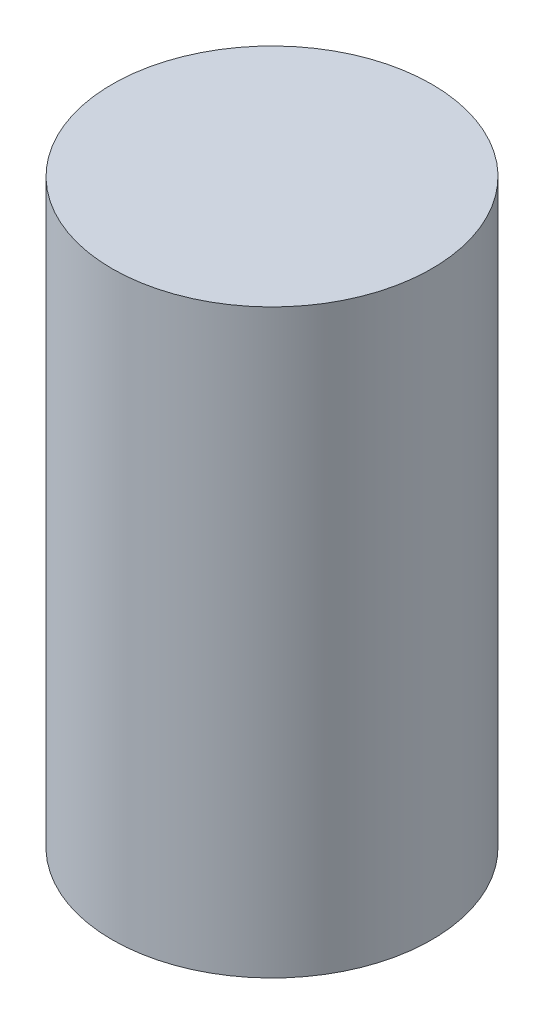
ISO-10303-21;
HEADER;
FILE_DESCRIPTION(('STEP AP214'),'2;1');
FILE_NAME('part.step','',(''),(''),'','','');
FILE_SCHEMA(('AUTOMOTIVE_DESIGN { 1 0 10303 214 1 1 1 1 }'));
ENDSEC;
DATA;
#1=APPLICATION_CONTEXT('core data for automotive mechanical design processes');
#2=APPLICATION_PROTOCOL_DEFINITION('international standard','automotive_design',2000,#1);
#3=PRODUCT_CONTEXT('',#1,'mechanical');
#4=PRODUCT('Part','Part','',(#3));
#5=PRODUCT_RELATED_PRODUCT_CATEGORY('part','',(#4));
#6=PRODUCT_DEFINITION_FORMATION('','',#4);
#7=PRODUCT_DEFINITION_CONTEXT('part definition',#1,'design');
#8=PRODUCT_DEFINITION('design','',#6,#7);
#9=PRODUCT_DEFINITION_SHAPE('','',#8);
#10=(LENGTH_UNIT() NAMED_UNIT(*) SI_UNIT(.MILLI.,.METRE.));
#11=(NAMED_UNIT(*) PLANE_ANGLE_UNIT() SI_UNIT($,.RADIAN.));
#12=(NAMED_UNIT(*) SI_UNIT($,.STERADIAN.) SOLID_ANGLE_UNIT());
#13=UNCERTAINTY_MEASURE_WITH_UNIT(LENGTH_MEASURE(1.E-05),#10,'distance_accuracy_value','');
#14=(GEOMETRIC_REPRESENTATION_CONTEXT(3) GLOBAL_UNCERTAINTY_ASSIGNED_CONTEXT((#13)) GLOBAL_UNIT_ASSIGNED_CONTEXT((#10,
#11,#12)) REPRESENTATION_CONTEXT('',''));
#15=CARTESIAN_POINT('',(0.,0.,0.));
#16=DIRECTION('',(0.,0.,1.));
#17=DIRECTION('',(1.,0.,0.));
#18=AXIS2_PLACEMENT_3D('',#15,#16,#17);
#19=CARTESIAN_POINT('',(0.,40.,0.));
#20=DIRECTION('',(0.,-1.,0.));
#21=DIRECTION('',(0.,0.,-1.));
#22=AXIS2_PLACEMENT_3D('',#19,#20,#21);
#23=CYLINDRICAL_SURFACE('',#22,11.);
#24=CARTESIAN_POINT('',(0.,40.,0.));
#25=DIRECTION('',(0.,1.,0.));
#26=DIRECTION('',(0.,0.,1.));
#27=AXIS2_PLACEMENT_3D('',#24,#25,#26);
#28=CIRCLE('',#27,11.);
#29=CARTESIAN_POINT('',(0.,40.,11.));
#30=VERTEX_POINT('',#29);
#31=EDGE_CURVE('E10',#30,#30,#28,.T.);
#32=ORIENTED_EDGE('',*,*,#31,.F.);
#33=EDGE_LOOP('',(#32));
#34=FACE_BOUND('',#33,.T.);
#35=CARTESIAN_POINT('',(0.,0.,0.));
#36=DIRECTION('',(0.,1.,0.));
#37=DIRECTION('',(0.,0.,1.));
#38=AXIS2_PLACEMENT_3D('',#35,#36,#37);
#39=CIRCLE('',#38,11.);
#40=CARTESIAN_POINT('',(0.,0.,11.));
#41=VERTEX_POINT('',#40);
#42=EDGE_CURVE('E38',#41,#41,#39,.T.);
#43=ORIENTED_EDGE('',*,*,#42,.T.);
#44=EDGE_LOOP('',(#43));
#45=FACE_BOUND('',#44,.T.);
#46=ADVANCED_FACE('F35',(#34,#45),#23,.T.);
#47=CARTESIAN_POINT('',(0.,40.,0.));
#48=DIRECTION('',(0.,1.,0.));
#49=DIRECTION('',(0.,0.,1.));
#50=AXIS2_PLACEMENT_3D('',#47,#48,#49);
#51=PLANE('',#50);
#52=ORIENTED_EDGE('',*,*,#31,.T.);
#53=EDGE_LOOP('',(#52));
#54=FACE_BOUND('',#53,.T.);
#55=ADVANCED_FACE('F50',(#54),#51,.T.);
#56=CARTESIAN_POINT('',(0.,0.,0.));
#57=DIRECTION('',(0.,1.,0.));
#58=DIRECTION('',(0.,0.,1.));
#59=AXIS2_PLACEMENT_3D('',#56,#57,#58);
#60=PLANE('',#59);
#61=ORIENTED_EDGE('',*,*,#42,.F.);
#62=EDGE_LOOP('',(#61));
#63=FACE_BOUND('',#62,.T.);
#64=ADVANCED_FACE('F48',(#63),#60,.F.);
#65=CLOSED_SHELL('',(#46,#55,#64));
#66=MANIFOLD_SOLID_BREP('B2',#65);
#67=ADVANCED_BREP_SHAPE_REPRESENTATION('',(#18,#66),#14);
#68=SHAPE_DEFINITION_REPRESENTATION(#9,#67);
ENDSEC;
END-ISO-10303-21;
